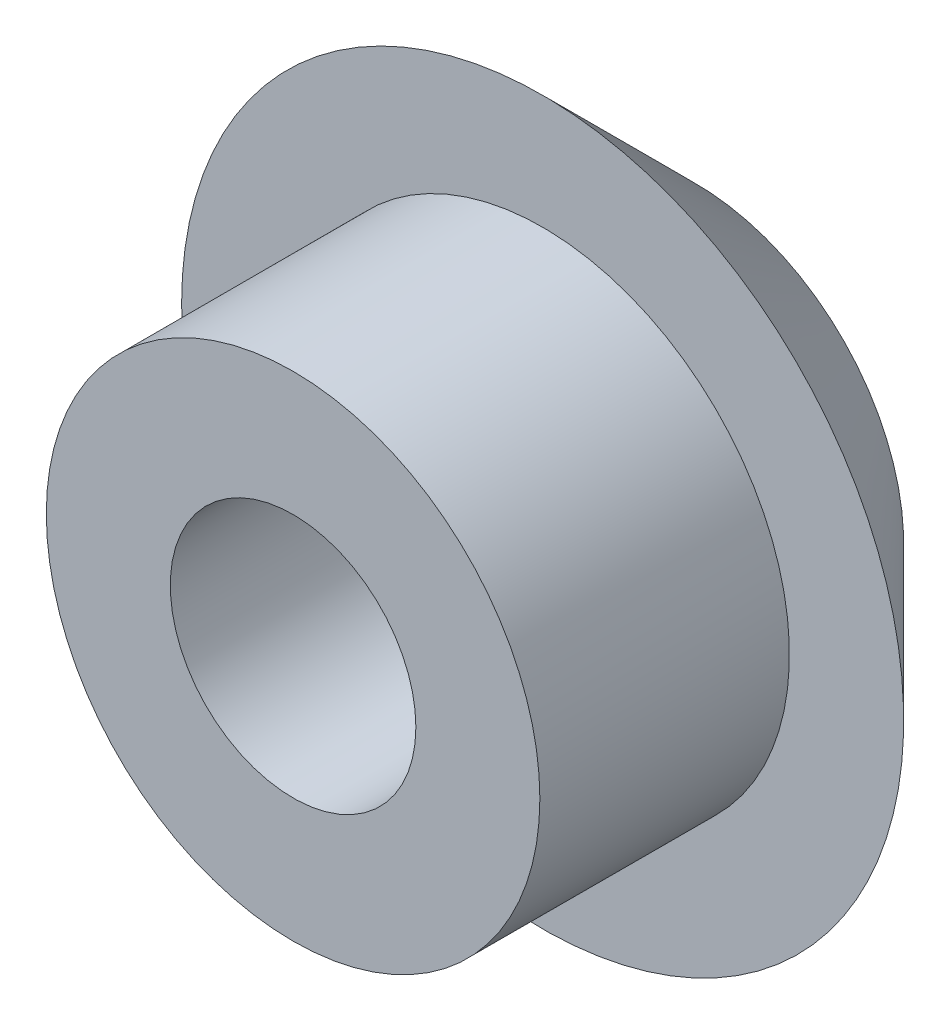
ISO-10303-21;
HEADER;
FILE_DESCRIPTION(('STEP AP214'),'2;1');
FILE_NAME('part.step','',(''),(''),'','','');
FILE_SCHEMA(('AUTOMOTIVE_DESIGN { 1 0 10303 214 1 1 1 1 }'));
ENDSEC;
DATA;
#1=APPLICATION_CONTEXT('core data for automotive mechanical design processes');
#2=APPLICATION_PROTOCOL_DEFINITION('international standard','automotive_design',2000,#1);
#3=PRODUCT_CONTEXT('',#1,'mechanical');
#4=PRODUCT('Part','Part','',(#3));
#5=PRODUCT_RELATED_PRODUCT_CATEGORY('part','',(#4));
#6=PRODUCT_DEFINITION_FORMATION('','',#4);
#7=PRODUCT_DEFINITION_CONTEXT('part definition',#1,'design');
#8=PRODUCT_DEFINITION('design','',#6,#7);
#9=PRODUCT_DEFINITION_SHAPE('','',#8);
#10=(LENGTH_UNIT() NAMED_UNIT(*) SI_UNIT(.MILLI.,.METRE.));
#11=(NAMED_UNIT(*) PLANE_ANGLE_UNIT() SI_UNIT($,.RADIAN.));
#12=(NAMED_UNIT(*) SI_UNIT($,.STERADIAN.) SOLID_ANGLE_UNIT());
#13=UNCERTAINTY_MEASURE_WITH_UNIT(LENGTH_MEASURE(1.E-05),#10,'distance_accuracy_value','');
#14=(GEOMETRIC_REPRESENTATION_CONTEXT(3) GLOBAL_UNCERTAINTY_ASSIGNED_CONTEXT((#13)) GLOBAL_UNIT_ASSIGNED_CONTEXT((#10,
#11,#12)) REPRESENTATION_CONTEXT('',''));
#15=CARTESIAN_POINT('',(0.,0.,0.));
#16=DIRECTION('',(0.,0.,1.));
#17=DIRECTION('',(1.,0.,0.));
#18=AXIS2_PLACEMENT_3D('',#15,#16,#17);
#19=CARTESIAN_POINT('',(0.,0.,10.14));
#20=DIRECTION('',(0.,0.,-1.));
#21=DIRECTION('',(-1.,0.,0.));
#22=AXIS2_PLACEMENT_3D('',#19,#20,#21);
#23=CYLINDRICAL_SURFACE('',#22,6.22);
#24=CARTESIAN_POINT('',(0.,0.,10.14));
#25=DIRECTION('',(0.,0.,1.));
#26=DIRECTION('',(1.,0.,0.));
#27=AXIS2_PLACEMENT_3D('',#24,#25,#26);
#28=CIRCLE('',#27,6.22);
#29=CARTESIAN_POINT('',(6.22,0.,10.14));
#30=VERTEX_POINT('',#29);
#31=EDGE_CURVE('E40',#30,#30,#28,.T.);
#32=ORIENTED_EDGE('',*,*,#31,.F.);
#33=EDGE_LOOP('',(#32));
#34=FACE_BOUND('',#33,.T.);
#35=CARTESIAN_POINT('',(0.,0.,3.85));
#36=DIRECTION('',(0.,0.,-1.));
#37=DIRECTION('',(-1.,0.,0.));
#38=AXIS2_PLACEMENT_3D('',#35,#36,#37);
#39=CIRCLE('',#38,6.22);
#40=CARTESIAN_POINT('',(-6.22,0.,3.85));
#41=VERTEX_POINT('',#40);
#42=EDGE_CURVE('E11',#41,#41,#39,.T.);
#43=ORIENTED_EDGE('',*,*,#42,.F.);
#44=EDGE_LOOP('',(#43));
#45=FACE_BOUND('',#44,.T.);
#46=ADVANCED_FACE('F33',(#34,#45),#23,.T.);
#47=CARTESIAN_POINT('',(0.,0.,10.14));
#48=DIRECTION('',(0.,0.,1.));
#49=DIRECTION('',(1.,0.,0.));
#50=AXIS2_PLACEMENT_3D('',#47,#48,#49);
#51=PLANE('',#50);
#52=ORIENTED_EDGE('',*,*,#31,.T.);
#53=EDGE_LOOP('',(#52));
#54=FACE_BOUND('',#53,.T.);
#55=CARTESIAN_POINT('',(0.,0.,10.14));
#56=DIRECTION('',(0.,0.,1.));
#57=DIRECTION('',(1.,0.,0.));
#58=AXIS2_PLACEMENT_3D('',#55,#56,#57);
#59=CIRCLE('',#58,3.095);
#60=CARTESIAN_POINT('',(3.095,0.,10.14));
#61=VERTEX_POINT('',#60);
#62=EDGE_CURVE('E58',#61,#61,#59,.T.);
#63=ORIENTED_EDGE('',*,*,#62,.F.);
#64=EDGE_LOOP('',(#63));
#65=FACE_BOUND('',#64,.T.);
#66=ADVANCED_FACE('F65',(#54,#65),#51,.T.);
#67=CARTESIAN_POINT('',(0.,0.,0.));
#68=DIRECTION('',(0.,0.,1.));
#69=DIRECTION('',(1.,0.,0.));
#70=AXIS2_PLACEMENT_3D('',#67,#68,#69);
#71=PLANE('',#70);
#72=CARTESIAN_POINT('',(0.,0.,0.));
#73=DIRECTION('',(0.,0.,-1.));
#74=DIRECTION('',(-1.,0.,0.));
#75=AXIS2_PLACEMENT_3D('',#72,#73,#74);
#76=CIRCLE('',#75,5.25000000000004);
#77=CARTESIAN_POINT('',(-5.25000000000004,0.,0.));
#78=VERTEX_POINT('',#77);
#79=EDGE_CURVE('E52',#78,#78,#76,.T.);
#80=ORIENTED_EDGE('',*,*,#79,.T.);
#81=EDGE_LOOP('',(#80));
#82=FACE_BOUND('',#81,.T.);
#83=CARTESIAN_POINT('',(0.,0.,0.));
#84=DIRECTION('',(0.,0.,1.));
#85=DIRECTION('',(1.,0.,0.));
#86=AXIS2_PLACEMENT_3D('',#83,#84,#85);
#87=CIRCLE('',#86,3.095);
#88=CARTESIAN_POINT('',(3.095,0.,0.));
#89=VERTEX_POINT('',#88);
#90=EDGE_CURVE('E57',#89,#89,#87,.T.);
#91=ORIENTED_EDGE('',*,*,#90,.T.);
#92=EDGE_LOOP('',(#91));
#93=FACE_BOUND('',#92,.T.);
#94=ADVANCED_FACE('F82',(#82,#93),#71,.F.);
#95=CARTESIAN_POINT('',(0.,0.,10.14));
#96=DIRECTION('',(0.,0.,-1.));
#97=DIRECTION('',(-1.,0.,0.));
#98=AXIS2_PLACEMENT_3D('',#95,#96,#97);
#99=CYLINDRICAL_SURFACE('',#98,3.095);
#100=ORIENTED_EDGE('',*,*,#62,.T.);
#101=EDGE_LOOP('',(#100));
#102=FACE_BOUND('',#101,.T.);
#103=ORIENTED_EDGE('',*,*,#90,.F.);
#104=EDGE_LOOP('',(#103));
#105=FACE_BOUND('',#104,.T.);
#106=ADVANCED_FACE('F75',(#102,#105),#99,.F.);
#107=CARTESIAN_POINT('',(0.,0.,3.85));
#108=DIRECTION('',(0.,0.,-1.));
#109=DIRECTION('',(-1.,0.,0.));
#110=AXIS2_PLACEMENT_3D('',#107,#108,#109);
#111=PLANE('',#110);
#112=ORIENTED_EDGE('',*,*,#42,.T.);
#113=EDGE_LOOP('',(#112));
#114=FACE_BOUND('',#113,.T.);
#115=CARTESIAN_POINT('',(0.,0.,3.85));
#116=DIRECTION('',(0.,0.,-1.));
#117=DIRECTION('',(-1.,0.,0.));
#118=AXIS2_PLACEMENT_3D('',#115,#116,#117);
#119=CIRCLE('',#118,9.1);
#120=CARTESIAN_POINT('',(-9.1,0.,3.85));
#121=VERTEX_POINT('',#120);
#122=EDGE_CURVE('E50',#121,#121,#119,.T.);
#123=ORIENTED_EDGE('',*,*,#122,.F.);
#124=EDGE_LOOP('',(#123));
#125=FACE_BOUND('',#124,.T.);
#126=ADVANCED_FACE('F72',(#114,#125),#111,.F.);
#127=CARTESIAN_POINT('',(0.,0.,3.85));
#128=DIRECTION('',(0.,0.,1.));
#129=DIRECTION('',(1.,0.,0.));
#130=AXIS2_PLACEMENT_3D('',#127,#128,#129);
#131=CONICAL_SURFACE('',#130,9.1,0.785398163397443);
#132=DIRECTION('',(0.707106781186544,0.,-0.707106781186551));
#133=VECTOR('',#132,1.);
#134=CARTESIAN_POINT('',(-9.1,0.,3.85));
#135=LINE('',#134,#133);
#136=EDGE_CURVE('E47',#121,#78,#135,.T.);
#137=ORIENTED_EDGE('',*,*,#136,.T.);
#138=ORIENTED_EDGE('',*,*,#79,.F.);
#139=ORIENTED_EDGE('',*,*,#136,.F.);
#140=ORIENTED_EDGE('',*,*,#122,.T.);
#141=EDGE_LOOP('',(#137,#138,#139,#140));
#142=FACE_BOUND('',#141,.T.);
#143=ADVANCED_FACE('F48',(#142),#131,.T.);
#144=CLOSED_SHELL('',(#46,#66,#94,#106,#126,#143));
#145=MANIFOLD_SOLID_BREP('B2',#144);
#146=ADVANCED_BREP_SHAPE_REPRESENTATION('',(#18,#145),#14);
#147=SHAPE_DEFINITION_REPRESENTATION(#9,#146);
ENDSEC;
END-ISO-10303-21;
